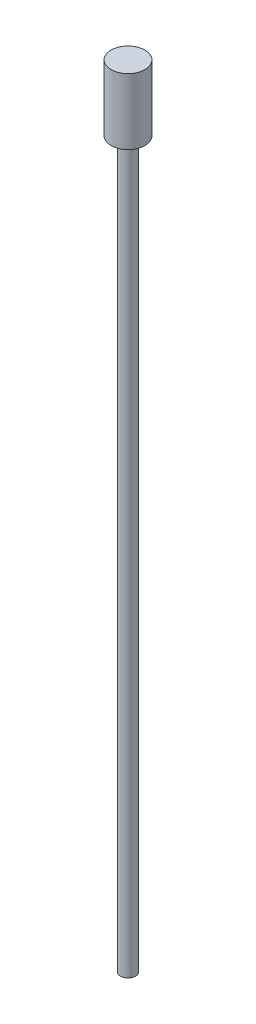
ISO-10303-21;
HEADER;
FILE_DESCRIPTION(('STEP AP214'),'2;1');
FILE_NAME('part.step','',(''),(''),'','','');
FILE_SCHEMA(('AUTOMOTIVE_DESIGN { 1 0 10303 214 1 1 1 1 }'));
ENDSEC;
DATA;
#1=APPLICATION_CONTEXT('core data for automotive mechanical design processes');
#2=APPLICATION_PROTOCOL_DEFINITION('international standard','automotive_design',2000,#1);
#3=PRODUCT_CONTEXT('',#1,'mechanical');
#4=PRODUCT('Part','Part','',(#3));
#5=PRODUCT_RELATED_PRODUCT_CATEGORY('part','',(#4));
#6=PRODUCT_DEFINITION_FORMATION('','',#4);
#7=PRODUCT_DEFINITION_CONTEXT('part definition',#1,'design');
#8=PRODUCT_DEFINITION('design','',#6,#7);
#9=PRODUCT_DEFINITION_SHAPE('','',#8);
#10=(LENGTH_UNIT() NAMED_UNIT(*) SI_UNIT(.MILLI.,.METRE.));
#11=(NAMED_UNIT(*) PLANE_ANGLE_UNIT() SI_UNIT($,.RADIAN.));
#12=(NAMED_UNIT(*) SI_UNIT($,.STERADIAN.) SOLID_ANGLE_UNIT());
#13=UNCERTAINTY_MEASURE_WITH_UNIT(LENGTH_MEASURE(1.E-05),#10,'distance_accuracy_value','');
#14=(GEOMETRIC_REPRESENTATION_CONTEXT(3) GLOBAL_UNCERTAINTY_ASSIGNED_CONTEXT((#13)) GLOBAL_UNIT_ASSIGNED_CONTEXT((#10,
#11,#12)) REPRESENTATION_CONTEXT('',''));
#15=CARTESIAN_POINT('',(0.,0.,0.));
#16=DIRECTION('',(0.,0.,1.));
#17=DIRECTION('',(1.,0.,0.));
#18=AXIS2_PLACEMENT_3D('',#15,#16,#17);
#19=CARTESIAN_POINT('',(0.,385.,0.));
#20=DIRECTION('',(0.,-1.,0.));
#21=DIRECTION('',(0.,0.,-1.));
#22=AXIS2_PLACEMENT_3D('',#19,#20,#21);
#23=CYLINDRICAL_SURFACE('',#22,4.);
#24=CARTESIAN_POINT('',(0.,385.,0.));
#25=DIRECTION('',(0.,1.,0.));
#26=DIRECTION('',(0.,0.,1.));
#27=AXIS2_PLACEMENT_3D('',#24,#25,#26);
#28=CIRCLE('',#27,4.);
#29=CARTESIAN_POINT('',(0.,385.,4.));
#30=VERTEX_POINT('',#29);
#31=EDGE_CURVE('E10',#30,#30,#28,.T.);
#32=ORIENTED_EDGE('',*,*,#31,.F.);
#33=EDGE_LOOP('',(#32));
#34=FACE_BOUND('',#33,.T.);
#35=CARTESIAN_POINT('',(0.,0.,0.));
#36=DIRECTION('',(0.,1.,0.));
#37=DIRECTION('',(0.,0.,1.));
#38=AXIS2_PLACEMENT_3D('',#35,#36,#37);
#39=CIRCLE('',#38,4.);
#40=CARTESIAN_POINT('',(0.,0.,4.));
#41=VERTEX_POINT('',#40);
#42=EDGE_CURVE('E40',#41,#41,#39,.T.);
#43=ORIENTED_EDGE('',*,*,#42,.T.);
#44=EDGE_LOOP('',(#43));
#45=FACE_BOUND('',#44,.T.);
#46=ADVANCED_FACE('F37',(#34,#45),#23,.T.);
#47=CARTESIAN_POINT('',(0.,0.,0.));
#48=DIRECTION('',(0.,1.,0.));
#49=DIRECTION('',(0.,0.,1.));
#50=AXIS2_PLACEMENT_3D('',#47,#48,#49);
#51=PLANE('',#50);
#52=ORIENTED_EDGE('',*,*,#42,.F.);
#53=EDGE_LOOP('',(#52));
#54=FACE_BOUND('',#53,.T.);
#55=ADVANCED_FACE('F60',(#54),#51,.F.);
#56=CARTESIAN_POINT('',(0.,420.,0.));
#57=DIRECTION('',(0.,-1.,0.));
#58=DIRECTION('',(0.,0.,-1.));
#59=AXIS2_PLACEMENT_3D('',#56,#57,#58);
#60=CYLINDRICAL_SURFACE('',#59,9.);
#61=CARTESIAN_POINT('',(0.,420.,0.));
#62=DIRECTION('',(0.,1.,0.));
#63=DIRECTION('',(0.,0.,1.));
#64=AXIS2_PLACEMENT_3D('',#61,#62,#63);
#65=CIRCLE('',#64,9.);
#66=CARTESIAN_POINT('',(0.,420.,9.));
#67=VERTEX_POINT('',#66);
#68=EDGE_CURVE('E47',#67,#67,#65,.T.);
#69=ORIENTED_EDGE('',*,*,#68,.F.);
#70=EDGE_LOOP('',(#69));
#71=FACE_BOUND('',#70,.T.);
#72=CARTESIAN_POINT('',(0.,385.,0.));
#73=DIRECTION('',(0.,1.,0.));
#74=DIRECTION('',(0.,0.,1.));
#75=AXIS2_PLACEMENT_3D('',#72,#73,#74);
#76=CIRCLE('',#75,9.);
#77=CARTESIAN_POINT('',(0.,385.,9.));
#78=VERTEX_POINT('',#77);
#79=EDGE_CURVE('E49',#78,#78,#76,.T.);
#80=ORIENTED_EDGE('',*,*,#79,.T.);
#81=EDGE_LOOP('',(#80));
#82=FACE_BOUND('',#81,.T.);
#83=ADVANCED_FACE('F57',(#71,#82),#60,.T.);
#84=CARTESIAN_POINT('',(0.,420.,0.));
#85=DIRECTION('',(0.,1.,0.));
#86=DIRECTION('',(0.,0.,1.));
#87=AXIS2_PLACEMENT_3D('',#84,#85,#86);
#88=PLANE('',#87);
#89=ORIENTED_EDGE('',*,*,#68,.T.);
#90=EDGE_LOOP('',(#89));
#91=FACE_BOUND('',#90,.T.);
#92=ADVANCED_FACE('F55',(#91),#88,.T.);
#93=CARTESIAN_POINT('',(0.,385.,0.));
#94=DIRECTION('',(0.,1.,0.));
#95=DIRECTION('',(0.,0.,1.));
#96=AXIS2_PLACEMENT_3D('',#93,#94,#95);
#97=PLANE('',#96);
#98=ORIENTED_EDGE('',*,*,#31,.T.);
#99=EDGE_LOOP('',(#98));
#100=FACE_BOUND('',#99,.T.);
#101=ORIENTED_EDGE('',*,*,#79,.F.);
#102=EDGE_LOOP('',(#101));
#103=FACE_BOUND('',#102,.T.);
#104=ADVANCED_FACE('F64',(#100,#103),#97,.F.);
#105=CLOSED_SHELL('',(#46,#55,#83,#92,#104));
#106=MANIFOLD_SOLID_BREP('B2',#105);
#107=ADVANCED_BREP_SHAPE_REPRESENTATION('',(#18,#106),#14);
#108=SHAPE_DEFINITION_REPRESENTATION(#9,#107);
ENDSEC;
END-ISO-10303-21;
